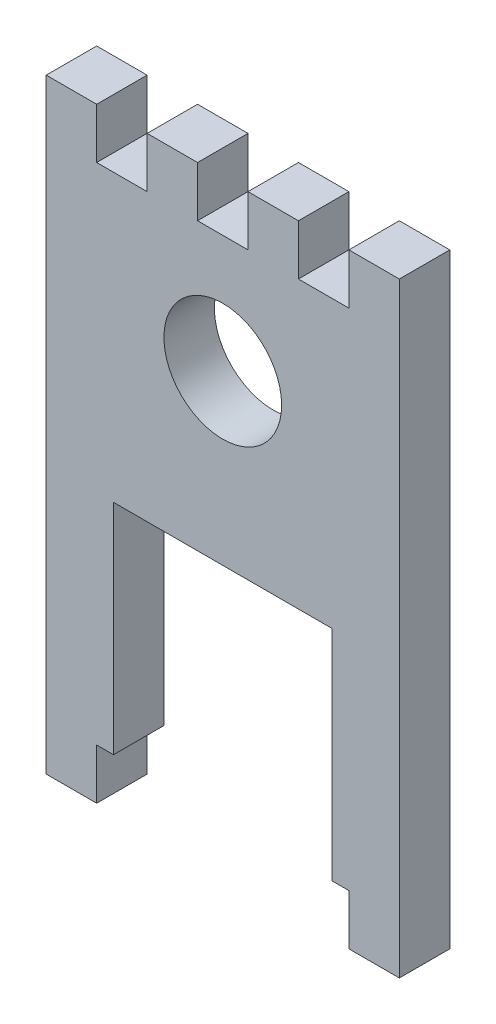
ISO-10303-21;
HEADER;
FILE_DESCRIPTION(('STEP AP214'),'2;1');
FILE_NAME('part.step','',(''),(''),'','','');
FILE_SCHEMA(('AUTOMOTIVE_DESIGN { 1 0 10303 214 1 1 1 1 }'));
ENDSEC;
DATA;
#1=APPLICATION_CONTEXT('core data for automotive mechanical design processes');
#2=APPLICATION_PROTOCOL_DEFINITION('international standard','automotive_design',2000,#1);
#3=PRODUCT_CONTEXT('',#1,'mechanical');
#4=PRODUCT('Part','Part','',(#3));
#5=PRODUCT_RELATED_PRODUCT_CATEGORY('part','',(#4));
#6=PRODUCT_DEFINITION_FORMATION('','',#4);
#7=PRODUCT_DEFINITION_CONTEXT('part definition',#1,'design');
#8=PRODUCT_DEFINITION('design','',#6,#7);
#9=PRODUCT_DEFINITION_SHAPE('','',#8);
#10=(LENGTH_UNIT() NAMED_UNIT(*) SI_UNIT(.MILLI.,.METRE.));
#11=(NAMED_UNIT(*) PLANE_ANGLE_UNIT() SI_UNIT($,.RADIAN.));
#12=(NAMED_UNIT(*) SI_UNIT($,.STERADIAN.) SOLID_ANGLE_UNIT());
#13=UNCERTAINTY_MEASURE_WITH_UNIT(LENGTH_MEASURE(1.E-05),#10,'distance_accuracy_value','');
#14=(GEOMETRIC_REPRESENTATION_CONTEXT(3) GLOBAL_UNCERTAINTY_ASSIGNED_CONTEXT((#13)) GLOBAL_UNIT_ASSIGNED_CONTEXT((#10,
#11,#12)) REPRESENTATION_CONTEXT('',''));
#15=CARTESIAN_POINT('',(0.,0.,0.));
#16=DIRECTION('',(0.,0.,1.));
#17=DIRECTION('',(1.,0.,0.));
#18=AXIS2_PLACEMENT_3D('',#15,#16,#17);
#19=CARTESIAN_POINT('',(0.,0.,3.));
#20=DIRECTION('',(0.,0.,1.));
#21=DIRECTION('',(1.,0.,0.));
#22=AXIS2_PLACEMENT_3D('',#19,#20,#21);
#23=PLANE('',#22);
#24=DIRECTION('',(0.,-1.,0.));
#25=VECTOR('',#24,1.);
#26=CARTESIAN_POINT('',(-9.96629949871549,13.71,3.));
#27=LINE('',#26,#25);
#28=CARTESIAN_POINT('',(-9.96629949871549,13.71,3.));
#29=VERTEX_POINT('',#28);
#30=CARTESIAN_POINT('',(-9.96629949871548,-22.29,3.));
#31=VERTEX_POINT('',#30);
#32=EDGE_CURVE('E276',#29,#31,#27,.T.);
#33=ORIENTED_EDGE('',*,*,#32,.T.);
#34=DIRECTION('',(1.,0.,0.));
#35=VECTOR('',#34,1.);
#36=CARTESIAN_POINT('',(-9.96629949871548,-22.29,3.));
#37=LINE('',#36,#35);
#38=CARTESIAN_POINT('',(-6.96629949871548,-22.29,3.));
#39=VERTEX_POINT('',#38);
#40=EDGE_CURVE('E144',#31,#39,#37,.T.);
#41=ORIENTED_EDGE('',*,*,#40,.T.);
#42=DIRECTION('',(0.,1.,0.));
#43=VECTOR('',#42,1.);
#44=CARTESIAN_POINT('',(-6.96629949871548,-19.29,3.));
#45=LINE('',#44,#43);
#46=CARTESIAN_POINT('',(-6.96629949871548,-19.29,3.));
#47=VERTEX_POINT('',#46);
#48=EDGE_CURVE('E339',#39,#47,#45,.T.);
#49=ORIENTED_EDGE('',*,*,#48,.T.);
#50=DIRECTION('',(1.,0.,0.));
#51=VECTOR('',#50,1.);
#52=CARTESIAN_POINT('',(-6.96629949871548,-19.29,3.));
#53=LINE('',#52,#51);
#54=CARTESIAN_POINT('',(-5.96629949871548,-19.29,3.));
#55=VERTEX_POINT('',#54);
#56=EDGE_CURVE('E358',#47,#55,#53,.T.);
#57=ORIENTED_EDGE('',*,*,#56,.T.);
#58=DIRECTION('',(0.,1.,0.));
#59=VECTOR('',#58,1.);
#60=CARTESIAN_POINT('',(-5.96629949871548,-6.29,3.));
#61=LINE('',#60,#59);
#62=CARTESIAN_POINT('',(-5.96629949871548,-6.29,3.));
#63=VERTEX_POINT('',#62);
#64=EDGE_CURVE('E355',#55,#63,#61,.T.);
#65=ORIENTED_EDGE('',*,*,#64,.T.);
#66=DIRECTION('',(1.,0.,0.));
#67=VECTOR('',#66,1.);
#68=CARTESIAN_POINT('',(-5.96629949871548,-6.29,3.));
#69=LINE('',#68,#67);
#70=CARTESIAN_POINT('',(7.03370050128452,-6.29,3.));
#71=VERTEX_POINT('',#70);
#72=EDGE_CURVE('E357',#63,#71,#69,.T.);
#73=ORIENTED_EDGE('',*,*,#72,.T.);
#74=DIRECTION('',(0.,-1.,0.));
#75=VECTOR('',#74,1.);
#76=CARTESIAN_POINT('',(7.03370050128452,-6.29,3.));
#77=LINE('',#76,#75);
#78=CARTESIAN_POINT('',(7.03370050128452,-19.29,3.));
#79=VERTEX_POINT('',#78);
#80=EDGE_CURVE('E360',#71,#79,#77,.T.);
#81=ORIENTED_EDGE('',*,*,#80,.T.);
#82=DIRECTION('',(1.,0.,0.));
#83=VECTOR('',#82,1.);
#84=CARTESIAN_POINT('',(8.03370050128452,-19.29,3.));
#85=LINE('',#84,#83);
#86=CARTESIAN_POINT('',(8.03370050128452,-19.29,3.));
#87=VERTEX_POINT('',#86);
#88=EDGE_CURVE('E366',#79,#87,#85,.T.);
#89=ORIENTED_EDGE('',*,*,#88,.T.);
#90=DIRECTION('',(0.,-1.,0.));
#91=VECTOR('',#90,1.);
#92=CARTESIAN_POINT('',(8.03370050128452,-19.29,3.));
#93=LINE('',#92,#91);
#94=CARTESIAN_POINT('',(8.03370050128452,-22.29,3.));
#95=VERTEX_POINT('',#94);
#96=EDGE_CURVE('E368',#87,#95,#93,.T.);
#97=ORIENTED_EDGE('',*,*,#96,.T.);
#98=DIRECTION('',(1.,0.,0.));
#99=VECTOR('',#98,1.);
#100=CARTESIAN_POINT('',(8.03370050128452,-22.29,3.));
#101=LINE('',#100,#99);
#102=CARTESIAN_POINT('',(11.0337005012845,-22.29,3.));
#103=VERTEX_POINT('',#102);
#104=EDGE_CURVE('E370',#95,#103,#101,.T.);
#105=ORIENTED_EDGE('',*,*,#104,.T.);
#106=DIRECTION('',(0.,1.,0.));
#107=VECTOR('',#106,1.);
#108=CARTESIAN_POINT('',(11.0337005012845,13.71,3.));
#109=LINE('',#108,#107);
#110=CARTESIAN_POINT('',(11.0337005012845,13.71,3.));
#111=VERTEX_POINT('',#110);
#112=EDGE_CURVE('E372',#103,#111,#109,.T.);
#113=ORIENTED_EDGE('',*,*,#112,.T.);
#114=DIRECTION('',(-1.,0.,0.));
#115=VECTOR('',#114,1.);
#116=CARTESIAN_POINT('',(8.03370050128452,13.71,3.));
#117=LINE('',#116,#115);
#118=CARTESIAN_POINT('',(8.03370050128452,13.71,3.));
#119=VERTEX_POINT('',#118);
#120=EDGE_CURVE('E374',#111,#119,#117,.T.);
#121=ORIENTED_EDGE('',*,*,#120,.T.);
#122=DIRECTION('',(0.,-1.,0.));
#123=VECTOR('',#122,1.);
#124=CARTESIAN_POINT('',(8.03370050128452,10.71,3.));
#125=LINE('',#124,#123);
#126=CARTESIAN_POINT('',(8.03370050128452,10.71,3.));
#127=VERTEX_POINT('',#126);
#128=EDGE_CURVE('E376',#119,#127,#125,.T.);
#129=ORIENTED_EDGE('',*,*,#128,.T.);
#130=DIRECTION('',(-1.,0.,0.));
#131=VECTOR('',#130,1.);
#132=CARTESIAN_POINT('',(8.03370050128452,10.71,3.));
#133=LINE('',#132,#131);
#134=CARTESIAN_POINT('',(5.03370050128452,10.71,3.));
#135=VERTEX_POINT('',#134);
#136=EDGE_CURVE('E378',#127,#135,#133,.T.);
#137=ORIENTED_EDGE('',*,*,#136,.T.);
#138=DIRECTION('',(0.,1.,0.));
#139=VECTOR('',#138,1.);
#140=CARTESIAN_POINT('',(5.03370050128452,10.71,3.));
#141=LINE('',#140,#139);
#142=CARTESIAN_POINT('',(5.03370050128452,13.71,3.));
#143=VERTEX_POINT('',#142);
#144=EDGE_CURVE('E380',#135,#143,#141,.T.);
#145=ORIENTED_EDGE('',*,*,#144,.T.);
#146=DIRECTION('',(-1.,0.,0.));
#147=VECTOR('',#146,1.);
#148=CARTESIAN_POINT('',(2.03370050128452,13.71,3.));
#149=LINE('',#148,#147);
#150=CARTESIAN_POINT('',(2.03370050128452,13.71,3.));
#151=VERTEX_POINT('',#150);
#152=EDGE_CURVE('E382',#143,#151,#149,.T.);
#153=ORIENTED_EDGE('',*,*,#152,.T.);
#154=DIRECTION('',(0.,-1.,0.));
#155=VECTOR('',#154,1.);
#156=CARTESIAN_POINT('',(2.03370050128452,10.71,3.));
#157=LINE('',#156,#155);
#158=CARTESIAN_POINT('',(2.03370050128452,10.71,3.));
#159=VERTEX_POINT('',#158);
#160=EDGE_CURVE('E384',#151,#159,#157,.T.);
#161=ORIENTED_EDGE('',*,*,#160,.T.);
#162=DIRECTION('',(-1.,0.,0.));
#163=VECTOR('',#162,1.);
#164=CARTESIAN_POINT('',(-0.966299498715482,10.71,3.));
#165=LINE('',#164,#163);
#166=CARTESIAN_POINT('',(-0.966299498715482,10.71,3.));
#167=VERTEX_POINT('',#166);
#168=EDGE_CURVE('E386',#159,#167,#165,.T.);
#169=ORIENTED_EDGE('',*,*,#168,.T.);
#170=DIRECTION('',(0.,1.,0.));
#171=VECTOR('',#170,1.);
#172=CARTESIAN_POINT('',(-0.966299498715482,10.71,3.));
#173=LINE('',#172,#171);
#174=CARTESIAN_POINT('',(-0.966299498715481,13.71,3.));
#175=VERTEX_POINT('',#174);
#176=EDGE_CURVE('E388',#167,#175,#173,.T.);
#177=ORIENTED_EDGE('',*,*,#176,.T.);
#178=DIRECTION('',(-1.,0.,0.));
#179=VECTOR('',#178,1.);
#180=CARTESIAN_POINT('',(-3.96629949871548,13.71,3.));
#181=LINE('',#180,#179);
#182=CARTESIAN_POINT('',(-3.96629949871548,13.71,3.));
#183=VERTEX_POINT('',#182);
#184=EDGE_CURVE('E390',#175,#183,#181,.T.);
#185=ORIENTED_EDGE('',*,*,#184,.T.);
#186=DIRECTION('',(0.,-1.,0.));
#187=VECTOR('',#186,1.);
#188=CARTESIAN_POINT('',(-3.96629949871548,10.71,3.));
#189=LINE('',#188,#187);
#190=CARTESIAN_POINT('',(-3.96629949871548,10.71,3.));
#191=VERTEX_POINT('',#190);
#192=EDGE_CURVE('E211',#183,#191,#189,.T.);
#193=ORIENTED_EDGE('',*,*,#192,.T.);
#194=DIRECTION('',(-1.,0.,0.));
#195=VECTOR('',#194,1.);
#196=CARTESIAN_POINT('',(-6.96629949871548,10.71,3.));
#197=LINE('',#196,#195);
#198=CARTESIAN_POINT('',(-6.96629949871548,10.71,3.));
#199=VERTEX_POINT('',#198);
#200=EDGE_CURVE('E205',#191,#199,#197,.T.);
#201=ORIENTED_EDGE('',*,*,#200,.T.);
#202=DIRECTION('',(0.,1.,0.));
#203=VECTOR('',#202,1.);
#204=CARTESIAN_POINT('',(-6.96629949871548,10.71,3.));
#205=LINE('',#204,#203);
#206=CARTESIAN_POINT('',(-6.96629949871548,13.71,3.));
#207=VERTEX_POINT('',#206);
#208=EDGE_CURVE('E209',#199,#207,#205,.T.);
#209=ORIENTED_EDGE('',*,*,#208,.T.);
#210=DIRECTION('',(-1.,0.,0.));
#211=VECTOR('',#210,1.);
#212=CARTESIAN_POINT('',(-9.96629949871549,13.71,3.));
#213=LINE('',#212,#211);
#214=EDGE_CURVE('E53',#207,#29,#213,.T.);
#215=ORIENTED_EDGE('',*,*,#214,.T.);
#216=EDGE_LOOP('',(#33,#41,#49,#57,#65,#73,#81,#89,#97,#105,#113,#121,#129,#137,#145,#153,#161,
#169,#177,#185,#193,#201,#209,#215));
#217=FACE_BOUND('',#216,.T.);
#218=CARTESIAN_POINT('',(0.533700501284521,3.71,3.));
#219=DIRECTION('',(0.,0.,1.));
#220=DIRECTION('',(1.,0.,0.));
#221=AXIS2_PLACEMENT_3D('',#218,#219,#220);
#222=CIRCLE('',#221,3.5);
#223=CARTESIAN_POINT('',(4.03370050128452,3.71,3.));
#224=VERTEX_POINT('',#223);
#225=EDGE_CURVE('E233',#224,#224,#222,.T.);
#226=ORIENTED_EDGE('',*,*,#225,.F.);
#227=EDGE_LOOP('',(#226));
#228=FACE_BOUND('',#227,.T.);
#229=ADVANCED_FACE('F36',(#217,#228),#23,.T.);
#230=CARTESIAN_POINT('',(0.,0.,0.));
#231=DIRECTION('',(0.,0.,1.));
#232=DIRECTION('',(1.,0.,0.));
#233=AXIS2_PLACEMENT_3D('',#230,#231,#232);
#234=PLANE('',#233);
#235=DIRECTION('',(0.,-1.,0.));
#236=VECTOR('',#235,1.);
#237=CARTESIAN_POINT('',(-9.96629949871549,13.71,0.));
#238=LINE('',#237,#236);
#239=CARTESIAN_POINT('',(-9.96629949871549,13.71,0.));
#240=VERTEX_POINT('',#239);
#241=CARTESIAN_POINT('',(-9.96629949871548,-22.29,0.));
#242=VERTEX_POINT('',#241);
#243=EDGE_CURVE('E229',#240,#242,#238,.T.);
#244=ORIENTED_EDGE('',*,*,#243,.F.);
#245=DIRECTION('',(-1.,0.,0.));
#246=VECTOR('',#245,1.);
#247=CARTESIAN_POINT('',(-9.96629949871549,13.71,0.));
#248=LINE('',#247,#246);
#249=CARTESIAN_POINT('',(-6.96629949871548,13.71,0.));
#250=VERTEX_POINT('',#249);
#251=EDGE_CURVE('E136',#250,#240,#248,.T.);
#252=ORIENTED_EDGE('',*,*,#251,.F.);
#253=DIRECTION('',(0.,1.,0.));
#254=VECTOR('',#253,1.);
#255=CARTESIAN_POINT('',(-6.96629949871548,10.71,0.));
#256=LINE('',#255,#254);
#257=CARTESIAN_POINT('',(-6.96629949871548,10.71,0.));
#258=VERTEX_POINT('',#257);
#259=EDGE_CURVE('E130',#258,#250,#256,.T.);
#260=ORIENTED_EDGE('',*,*,#259,.F.);
#261=DIRECTION('',(-1.,0.,0.));
#262=VECTOR('',#261,1.);
#263=CARTESIAN_POINT('',(-6.96629949871548,10.71,0.));
#264=LINE('',#263,#262);
#265=CARTESIAN_POINT('',(-3.96629949871548,10.71,0.));
#266=VERTEX_POINT('',#265);
#267=EDGE_CURVE('E219',#266,#258,#264,.T.);
#268=ORIENTED_EDGE('',*,*,#267,.F.);
#269=DIRECTION('',(0.,-1.,0.));
#270=VECTOR('',#269,1.);
#271=CARTESIAN_POINT('',(-3.96629949871548,10.71,0.));
#272=LINE('',#271,#270);
#273=CARTESIAN_POINT('',(-3.96629949871548,13.71,0.));
#274=VERTEX_POINT('',#273);
#275=EDGE_CURVE('E271',#274,#266,#272,.T.);
#276=ORIENTED_EDGE('',*,*,#275,.F.);
#277=DIRECTION('',(-1.,0.,0.));
#278=VECTOR('',#277,1.);
#279=CARTESIAN_POINT('',(-3.96629949871548,13.71,0.));
#280=LINE('',#279,#278);
#281=CARTESIAN_POINT('',(-0.966299498715481,13.71,0.));
#282=VERTEX_POINT('',#281);
#283=EDGE_CURVE('E269',#282,#274,#280,.T.);
#284=ORIENTED_EDGE('',*,*,#283,.F.);
#285=DIRECTION('',(0.,1.,0.));
#286=VECTOR('',#285,1.);
#287=CARTESIAN_POINT('',(-0.966299498715482,10.71,0.));
#288=LINE('',#287,#286);
#289=CARTESIAN_POINT('',(-0.966299498715482,10.71,0.));
#290=VERTEX_POINT('',#289);
#291=EDGE_CURVE('E267',#290,#282,#288,.T.);
#292=ORIENTED_EDGE('',*,*,#291,.F.);
#293=DIRECTION('',(-1.,0.,0.));
#294=VECTOR('',#293,1.);
#295=CARTESIAN_POINT('',(-0.966299498715482,10.71,0.));
#296=LINE('',#295,#294);
#297=CARTESIAN_POINT('',(2.03370050128452,10.71,0.));
#298=VERTEX_POINT('',#297);
#299=EDGE_CURVE('E265',#298,#290,#296,.T.);
#300=ORIENTED_EDGE('',*,*,#299,.F.);
#301=DIRECTION('',(0.,-1.,0.));
#302=VECTOR('',#301,1.);
#303=CARTESIAN_POINT('',(2.03370050128452,10.71,0.));
#304=LINE('',#303,#302);
#305=CARTESIAN_POINT('',(2.03370050128452,13.71,0.));
#306=VERTEX_POINT('',#305);
#307=EDGE_CURVE('E263',#306,#298,#304,.T.);
#308=ORIENTED_EDGE('',*,*,#307,.F.);
#309=DIRECTION('',(-1.,0.,0.));
#310=VECTOR('',#309,1.);
#311=CARTESIAN_POINT('',(2.03370050128452,13.71,0.));
#312=LINE('',#311,#310);
#313=CARTESIAN_POINT('',(5.03370050128452,13.71,0.));
#314=VERTEX_POINT('',#313);
#315=EDGE_CURVE('E261',#314,#306,#312,.T.);
#316=ORIENTED_EDGE('',*,*,#315,.F.);
#317=DIRECTION('',(0.,1.,0.));
#318=VECTOR('',#317,1.);
#319=CARTESIAN_POINT('',(5.03370050128452,10.71,0.));
#320=LINE('',#319,#318);
#321=CARTESIAN_POINT('',(5.03370050128452,10.71,0.));
#322=VERTEX_POINT('',#321);
#323=EDGE_CURVE('E259',#322,#314,#320,.T.);
#324=ORIENTED_EDGE('',*,*,#323,.F.);
#325=DIRECTION('',(-1.,0.,0.));
#326=VECTOR('',#325,1.);
#327=CARTESIAN_POINT('',(8.03370050128452,10.71,0.));
#328=LINE('',#327,#326);
#329=CARTESIAN_POINT('',(8.03370050128452,10.71,0.));
#330=VERTEX_POINT('',#329);
#331=EDGE_CURVE('E257',#330,#322,#328,.T.);
#332=ORIENTED_EDGE('',*,*,#331,.F.);
#333=DIRECTION('',(0.,-1.,0.));
#334=VECTOR('',#333,1.);
#335=CARTESIAN_POINT('',(8.03370050128452,10.71,0.));
#336=LINE('',#335,#334);
#337=CARTESIAN_POINT('',(8.03370050128452,13.71,0.));
#338=VERTEX_POINT('',#337);
#339=EDGE_CURVE('E255',#338,#330,#336,.T.);
#340=ORIENTED_EDGE('',*,*,#339,.F.);
#341=DIRECTION('',(-1.,0.,0.));
#342=VECTOR('',#341,1.);
#343=CARTESIAN_POINT('',(8.03370050128452,13.71,0.));
#344=LINE('',#343,#342);
#345=CARTESIAN_POINT('',(11.0337005012845,13.71,0.));
#346=VERTEX_POINT('',#345);
#347=EDGE_CURVE('E253',#346,#338,#344,.T.);
#348=ORIENTED_EDGE('',*,*,#347,.F.);
#349=DIRECTION('',(0.,1.,0.));
#350=VECTOR('',#349,1.);
#351=CARTESIAN_POINT('',(11.0337005012845,13.71,0.));
#352=LINE('',#351,#350);
#353=CARTESIAN_POINT('',(11.0337005012845,-22.29,0.));
#354=VERTEX_POINT('',#353);
#355=EDGE_CURVE('E251',#354,#346,#352,.T.);
#356=ORIENTED_EDGE('',*,*,#355,.F.);
#357=DIRECTION('',(1.,0.,0.));
#358=VECTOR('',#357,1.);
#359=CARTESIAN_POINT('',(8.03370050128452,-22.29,0.));
#360=LINE('',#359,#358);
#361=CARTESIAN_POINT('',(8.03370050128452,-22.29,0.));
#362=VERTEX_POINT('',#361);
#363=EDGE_CURVE('E249',#362,#354,#360,.T.);
#364=ORIENTED_EDGE('',*,*,#363,.F.);
#365=DIRECTION('',(0.,-1.,0.));
#366=VECTOR('',#365,1.);
#367=CARTESIAN_POINT('',(8.03370050128452,-19.29,0.));
#368=LINE('',#367,#366);
#369=CARTESIAN_POINT('',(8.03370050128452,-19.29,0.));
#370=VERTEX_POINT('',#369);
#371=EDGE_CURVE('E247',#370,#362,#368,.T.);
#372=ORIENTED_EDGE('',*,*,#371,.F.);
#373=DIRECTION('',(1.,0.,0.));
#374=VECTOR('',#373,1.);
#375=CARTESIAN_POINT('',(8.03370050128452,-19.29,0.));
#376=LINE('',#375,#374);
#377=CARTESIAN_POINT('',(7.03370050128452,-19.29,0.));
#378=VERTEX_POINT('',#377);
#379=EDGE_CURVE('E245',#378,#370,#376,.T.);
#380=ORIENTED_EDGE('',*,*,#379,.F.);
#381=DIRECTION('',(0.,-1.,0.));
#382=VECTOR('',#381,1.);
#383=CARTESIAN_POINT('',(7.03370050128452,-6.29,0.));
#384=LINE('',#383,#382);
#385=CARTESIAN_POINT('',(7.03370050128452,-6.29,0.));
#386=VERTEX_POINT('',#385);
#387=EDGE_CURVE('E243',#386,#378,#384,.T.);
#388=ORIENTED_EDGE('',*,*,#387,.F.);
#389=DIRECTION('',(1.,0.,0.));
#390=VECTOR('',#389,1.);
#391=CARTESIAN_POINT('',(-5.96629949871548,-6.29,0.));
#392=LINE('',#391,#390);
#393=CARTESIAN_POINT('',(-5.96629949871548,-6.29,0.));
#394=VERTEX_POINT('',#393);
#395=EDGE_CURVE('E241',#394,#386,#392,.T.);
#396=ORIENTED_EDGE('',*,*,#395,.F.);
#397=DIRECTION('',(0.,1.,0.));
#398=VECTOR('',#397,1.);
#399=CARTESIAN_POINT('',(-5.96629949871548,-6.29,0.));
#400=LINE('',#399,#398);
#401=CARTESIAN_POINT('',(-5.96629949871548,-19.29,0.));
#402=VERTEX_POINT('',#401);
#403=EDGE_CURVE('E239',#402,#394,#400,.T.);
#404=ORIENTED_EDGE('',*,*,#403,.F.);
#405=DIRECTION('',(1.,0.,0.));
#406=VECTOR('',#405,1.);
#407=CARTESIAN_POINT('',(-6.96629949871548,-19.29,0.));
#408=LINE('',#407,#406);
#409=CARTESIAN_POINT('',(-6.96629949871548,-19.29,0.));
#410=VERTEX_POINT('',#409);
#411=EDGE_CURVE('E237',#410,#402,#408,.T.);
#412=ORIENTED_EDGE('',*,*,#411,.F.);
#413=DIRECTION('',(0.,1.,0.));
#414=VECTOR('',#413,1.);
#415=CARTESIAN_POINT('',(-6.96629949871548,-19.29,0.));
#416=LINE('',#415,#414);
#417=CARTESIAN_POINT('',(-6.96629949871548,-22.29,0.));
#418=VERTEX_POINT('',#417);
#419=EDGE_CURVE('E235',#418,#410,#416,.T.);
#420=ORIENTED_EDGE('',*,*,#419,.F.);
#421=DIRECTION('',(1.,0.,0.));
#422=VECTOR('',#421,1.);
#423=CARTESIAN_POINT('',(-9.96629949871548,-22.29,0.));
#424=LINE('',#423,#422);
#425=EDGE_CURVE('E232',#242,#418,#424,.T.);
#426=ORIENTED_EDGE('',*,*,#425,.F.);
#427=EDGE_LOOP('',(#244,#252,#260,#268,#276,#284,#292,#300,#308,#316,#324,#332,#340,#348,#356,
#364,#372,#380,#388,#396,#404,#412,#420,#426));
#428=FACE_BOUND('',#427,.T.);
#429=CARTESIAN_POINT('',(0.533700501284521,3.71,0.));
#430=DIRECTION('',(0.,0.,1.));
#431=DIRECTION('',(1.,0.,0.));
#432=AXIS2_PLACEMENT_3D('',#429,#430,#431);
#433=CIRCLE('',#432,3.5);
#434=CARTESIAN_POINT('',(4.03370050128452,3.71,0.));
#435=VERTEX_POINT('',#434);
#436=EDGE_CURVE('E693',#435,#435,#433,.T.);
#437=ORIENTED_EDGE('',*,*,#436,.T.);
#438=EDGE_LOOP('',(#437));
#439=FACE_BOUND('',#438,.T.);
#440=ADVANCED_FACE('F343',(#428,#439),#234,.F.);
#441=CARTESIAN_POINT('',(-9.96629949871549,13.71,3.));
#442=DIRECTION('',(1.,0.,0.));
#443=DIRECTION('',(0.,1.,0.));
#444=AXIS2_PLACEMENT_3D('',#441,#442,#443);
#445=PLANE('',#444);
#446=ORIENTED_EDGE('',*,*,#243,.T.);
#447=DIRECTION('',(0.,0.,-1.));
#448=VECTOR('',#447,1.);
#449=CARTESIAN_POINT('',(-9.96629949871548,-22.29,3.));
#450=LINE('',#449,#448);
#451=EDGE_CURVE('E11',#31,#242,#450,.T.);
#452=ORIENTED_EDGE('',*,*,#451,.F.);
#453=ORIENTED_EDGE('',*,*,#32,.F.);
#454=DIRECTION('',(0.,0.,-1.));
#455=VECTOR('',#454,1.);
#456=CARTESIAN_POINT('',(-9.96629949871549,13.71,3.));
#457=LINE('',#456,#455);
#458=EDGE_CURVE('E225',#29,#240,#457,.T.);
#459=ORIENTED_EDGE('',*,*,#458,.T.);
#460=EDGE_LOOP('',(#446,#452,#453,#459));
#461=FACE_BOUND('',#460,.T.);
#462=ADVANCED_FACE('F38',(#461),#445,.F.);
#463=CARTESIAN_POINT('',(-9.96629949871548,-22.29,3.));
#464=DIRECTION('',(0.,1.,0.));
#465=DIRECTION('',(0.,0.,1.));
#466=AXIS2_PLACEMENT_3D('',#463,#464,#465);
#467=PLANE('',#466);
#468=ORIENTED_EDGE('',*,*,#425,.T.);
#469=DIRECTION('',(0.,0.,-1.));
#470=VECTOR('',#469,1.);
#471=CARTESIAN_POINT('',(-6.96629949871548,-22.29,3.));
#472=LINE('',#471,#470);
#473=EDGE_CURVE('E45',#39,#418,#472,.T.);
#474=ORIENTED_EDGE('',*,*,#473,.F.);
#475=ORIENTED_EDGE('',*,*,#40,.F.);
#476=ORIENTED_EDGE('',*,*,#451,.T.);
#477=EDGE_LOOP('',(#468,#474,#475,#476));
#478=FACE_BOUND('',#477,.T.);
#479=ADVANCED_FACE('F424',(#478),#467,.F.);
#480=CARTESIAN_POINT('',(-6.96629949871548,-19.29,3.));
#481=DIRECTION('',(-1.,0.,0.));
#482=DIRECTION('',(0.,0.,1.));
#483=AXIS2_PLACEMENT_3D('',#480,#481,#482);
#484=PLANE('',#483);
#485=ORIENTED_EDGE('',*,*,#419,.T.);
#486=DIRECTION('',(0.,0.,-1.));
#487=VECTOR('',#486,1.);
#488=CARTESIAN_POINT('',(-6.96629949871548,-19.29,3.));
#489=LINE('',#488,#487);
#490=EDGE_CURVE('E331',#47,#410,#489,.T.);
#491=ORIENTED_EDGE('',*,*,#490,.F.);
#492=ORIENTED_EDGE('',*,*,#48,.F.);
#493=ORIENTED_EDGE('',*,*,#473,.T.);
#494=EDGE_LOOP('',(#485,#491,#492,#493));
#495=FACE_BOUND('',#494,.T.);
#496=ADVANCED_FACE('F337',(#495),#484,.F.);
#497=CARTESIAN_POINT('',(-6.96629949871548,-19.29,3.));
#498=DIRECTION('',(0.,1.,0.));
#499=DIRECTION('',(0.,0.,1.));
#500=AXIS2_PLACEMENT_3D('',#497,#498,#499);
#501=PLANE('',#500);
#502=ORIENTED_EDGE('',*,*,#411,.T.);
#503=DIRECTION('',(0.,0.,-1.));
#504=VECTOR('',#503,1.);
#505=CARTESIAN_POINT('',(-5.96629949871548,-19.29,3.));
#506=LINE('',#505,#504);
#507=EDGE_CURVE('E328',#55,#402,#506,.T.);
#508=ORIENTED_EDGE('',*,*,#507,.F.);
#509=ORIENTED_EDGE('',*,*,#56,.F.);
#510=ORIENTED_EDGE('',*,*,#490,.T.);
#511=EDGE_LOOP('',(#502,#508,#509,#510));
#512=FACE_BOUND('',#511,.T.);
#513=ADVANCED_FACE('F349',(#512),#501,.F.);
#514=CARTESIAN_POINT('',(-5.96629949871548,-6.29,3.));
#515=DIRECTION('',(-1.,0.,0.));
#516=DIRECTION('',(0.,-1.,0.));
#517=AXIS2_PLACEMENT_3D('',#514,#515,#516);
#518=PLANE('',#517);
#519=ORIENTED_EDGE('',*,*,#403,.T.);
#520=DIRECTION('',(0.,0.,-1.));
#521=VECTOR('',#520,1.);
#522=CARTESIAN_POINT('',(-5.96629949871548,-6.29,3.));
#523=LINE('',#522,#521);
#524=EDGE_CURVE('E325',#63,#394,#523,.T.);
#525=ORIENTED_EDGE('',*,*,#524,.F.);
#526=ORIENTED_EDGE('',*,*,#64,.F.);
#527=ORIENTED_EDGE('',*,*,#507,.T.);
#528=EDGE_LOOP('',(#519,#525,#526,#527));
#529=FACE_BOUND('',#528,.T.);
#530=ADVANCED_FACE('F353',(#529),#518,.F.);
#531=CARTESIAN_POINT('',(-5.96629949871548,-6.29,3.));
#532=DIRECTION('',(0.,1.,0.));
#533=DIRECTION('',(0.,0.,1.));
#534=AXIS2_PLACEMENT_3D('',#531,#532,#533);
#535=PLANE('',#534);
#536=ORIENTED_EDGE('',*,*,#395,.T.);
#537=DIRECTION('',(0.,0.,-1.));
#538=VECTOR('',#537,1.);
#539=CARTESIAN_POINT('',(7.03370050128452,-6.29,3.));
#540=LINE('',#539,#538);
#541=EDGE_CURVE('E322',#71,#386,#540,.T.);
#542=ORIENTED_EDGE('',*,*,#541,.F.);
#543=ORIENTED_EDGE('',*,*,#72,.F.);
#544=ORIENTED_EDGE('',*,*,#524,.T.);
#545=EDGE_LOOP('',(#536,#542,#543,#544));
#546=FACE_BOUND('',#545,.T.);
#547=ADVANCED_FACE('F437',(#546),#535,.F.);
#548=CARTESIAN_POINT('',(7.03370050128452,-6.29,3.));
#549=DIRECTION('',(1.,0.,0.));
#550=DIRECTION('',(0.,1.,0.));
#551=AXIS2_PLACEMENT_3D('',#548,#549,#550);
#552=PLANE('',#551);
#553=ORIENTED_EDGE('',*,*,#387,.T.);
#554=DIRECTION('',(0.,0.,-1.));
#555=VECTOR('',#554,1.);
#556=CARTESIAN_POINT('',(7.03370050128452,-19.29,3.));
#557=LINE('',#556,#555);
#558=EDGE_CURVE('E319',#79,#378,#557,.T.);
#559=ORIENTED_EDGE('',*,*,#558,.F.);
#560=ORIENTED_EDGE('',*,*,#80,.F.);
#561=ORIENTED_EDGE('',*,*,#541,.T.);
#562=EDGE_LOOP('',(#553,#559,#560,#561));
#563=FACE_BOUND('',#562,.T.);
#564=ADVANCED_FACE('F440',(#563),#552,.F.);
#565=CARTESIAN_POINT('',(8.03370050128452,-19.29,3.));
#566=DIRECTION('',(0.,1.,0.));
#567=DIRECTION('',(0.,0.,1.));
#568=AXIS2_PLACEMENT_3D('',#565,#566,#567);
#569=PLANE('',#568);
#570=ORIENTED_EDGE('',*,*,#379,.T.);
#571=DIRECTION('',(0.,0.,-1.));
#572=VECTOR('',#571,1.);
#573=CARTESIAN_POINT('',(8.03370050128452,-19.29,3.));
#574=LINE('',#573,#572);
#575=EDGE_CURVE('E316',#87,#370,#574,.T.);
#576=ORIENTED_EDGE('',*,*,#575,.F.);
#577=ORIENTED_EDGE('',*,*,#88,.F.);
#578=ORIENTED_EDGE('',*,*,#558,.T.);
#579=EDGE_LOOP('',(#570,#576,#577,#578));
#580=FACE_BOUND('',#579,.T.);
#581=ADVANCED_FACE('F444',(#580),#569,.F.);
#582=CARTESIAN_POINT('',(8.03370050128452,-19.29,3.));
#583=DIRECTION('',(1.,0.,0.));
#584=DIRECTION('',(0.,0.,-1.));
#585=AXIS2_PLACEMENT_3D('',#582,#583,#584);
#586=PLANE('',#585);
#587=ORIENTED_EDGE('',*,*,#371,.T.);
#588=DIRECTION('',(0.,0.,-1.));
#589=VECTOR('',#588,1.);
#590=CARTESIAN_POINT('',(8.03370050128452,-22.29,3.));
#591=LINE('',#590,#589);
#592=EDGE_CURVE('E313',#95,#362,#591,.T.);
#593=ORIENTED_EDGE('',*,*,#592,.F.);
#594=ORIENTED_EDGE('',*,*,#96,.F.);
#595=ORIENTED_EDGE('',*,*,#575,.T.);
#596=EDGE_LOOP('',(#587,#593,#594,#595));
#597=FACE_BOUND('',#596,.T.);
#598=ADVANCED_FACE('F448',(#597),#586,.F.);
#599=CARTESIAN_POINT('',(8.03370050128452,-22.29,3.));
#600=DIRECTION('',(0.,1.,0.));
#601=DIRECTION('',(0.,0.,1.));
#602=AXIS2_PLACEMENT_3D('',#599,#600,#601);
#603=PLANE('',#602);
#604=ORIENTED_EDGE('',*,*,#363,.T.);
#605=DIRECTION('',(0.,0.,-1.));
#606=VECTOR('',#605,1.);
#607=CARTESIAN_POINT('',(11.0337005012845,-22.29,3.));
#608=LINE('',#607,#606);
#609=EDGE_CURVE('E310',#103,#354,#608,.T.);
#610=ORIENTED_EDGE('',*,*,#609,.F.);
#611=ORIENTED_EDGE('',*,*,#104,.F.);
#612=ORIENTED_EDGE('',*,*,#592,.T.);
#613=EDGE_LOOP('',(#604,#610,#611,#612));
#614=FACE_BOUND('',#613,.T.);
#615=ADVANCED_FACE('F452',(#614),#603,.F.);
#616=CARTESIAN_POINT('',(11.0337005012845,13.71,3.));
#617=DIRECTION('',(-1.,0.,0.));
#618=DIRECTION('',(0.,-1.,0.));
#619=AXIS2_PLACEMENT_3D('',#616,#617,#618);
#620=PLANE('',#619);
#621=ORIENTED_EDGE('',*,*,#355,.T.);
#622=DIRECTION('',(0.,0.,-1.));
#623=VECTOR('',#622,1.);
#624=CARTESIAN_POINT('',(11.0337005012845,13.71,3.));
#625=LINE('',#624,#623);
#626=EDGE_CURVE('E307',#111,#346,#625,.T.);
#627=ORIENTED_EDGE('',*,*,#626,.F.);
#628=ORIENTED_EDGE('',*,*,#112,.F.);
#629=ORIENTED_EDGE('',*,*,#609,.T.);
#630=EDGE_LOOP('',(#621,#627,#628,#629));
#631=FACE_BOUND('',#630,.T.);
#632=ADVANCED_FACE('F456',(#631),#620,.F.);
#633=CARTESIAN_POINT('',(8.03370050128452,13.71,3.));
#634=DIRECTION('',(0.,-1.,0.));
#635=DIRECTION('',(0.,0.,-1.));
#636=AXIS2_PLACEMENT_3D('',#633,#634,#635);
#637=PLANE('',#636);
#638=ORIENTED_EDGE('',*,*,#347,.T.);
#639=DIRECTION('',(0.,0.,-1.));
#640=VECTOR('',#639,1.);
#641=CARTESIAN_POINT('',(8.03370050128452,13.71,3.));
#642=LINE('',#641,#640);
#643=EDGE_CURVE('E304',#119,#338,#642,.T.);
#644=ORIENTED_EDGE('',*,*,#643,.F.);
#645=ORIENTED_EDGE('',*,*,#120,.F.);
#646=ORIENTED_EDGE('',*,*,#626,.T.);
#647=EDGE_LOOP('',(#638,#644,#645,#646));
#648=FACE_BOUND('',#647,.T.);
#649=ADVANCED_FACE('F460',(#648),#637,.F.);
#650=CARTESIAN_POINT('',(8.03370050128452,10.71,3.));
#651=DIRECTION('',(1.,0.,0.));
#652=DIRECTION('',(0.,0.,-1.));
#653=AXIS2_PLACEMENT_3D('',#650,#651,#652);
#654=PLANE('',#653);
#655=ORIENTED_EDGE('',*,*,#339,.T.);
#656=DIRECTION('',(0.,0.,-1.));
#657=VECTOR('',#656,1.);
#658=CARTESIAN_POINT('',(8.03370050128452,10.71,3.));
#659=LINE('',#658,#657);
#660=EDGE_CURVE('E301',#127,#330,#659,.T.);
#661=ORIENTED_EDGE('',*,*,#660,.F.);
#662=ORIENTED_EDGE('',*,*,#128,.F.);
#663=ORIENTED_EDGE('',*,*,#643,.T.);
#664=EDGE_LOOP('',(#655,#661,#662,#663));
#665=FACE_BOUND('',#664,.T.);
#666=ADVANCED_FACE('F464',(#665),#654,.F.);
#667=CARTESIAN_POINT('',(8.03370050128452,10.71,3.));
#668=DIRECTION('',(0.,-1.,0.));
#669=DIRECTION('',(0.,0.,-1.));
#670=AXIS2_PLACEMENT_3D('',#667,#668,#669);
#671=PLANE('',#670);
#672=ORIENTED_EDGE('',*,*,#331,.T.);
#673=DIRECTION('',(0.,0.,-1.));
#674=VECTOR('',#673,1.);
#675=CARTESIAN_POINT('',(5.03370050128452,10.71,3.));
#676=LINE('',#675,#674);
#677=EDGE_CURVE('E298',#135,#322,#676,.T.);
#678=ORIENTED_EDGE('',*,*,#677,.F.);
#679=ORIENTED_EDGE('',*,*,#136,.F.);
#680=ORIENTED_EDGE('',*,*,#660,.T.);
#681=EDGE_LOOP('',(#672,#678,#679,#680));
#682=FACE_BOUND('',#681,.T.);
#683=ADVANCED_FACE('F468',(#682),#671,.F.);
#684=CARTESIAN_POINT('',(5.03370050128452,10.71,3.));
#685=DIRECTION('',(-1.,0.,0.));
#686=DIRECTION('',(0.,-1.,0.));
#687=AXIS2_PLACEMENT_3D('',#684,#685,#686);
#688=PLANE('',#687);
#689=ORIENTED_EDGE('',*,*,#323,.T.);
#690=DIRECTION('',(0.,0.,-1.));
#691=VECTOR('',#690,1.);
#692=CARTESIAN_POINT('',(5.03370050128452,13.71,3.));
#693=LINE('',#692,#691);
#694=EDGE_CURVE('E295',#143,#314,#693,.T.);
#695=ORIENTED_EDGE('',*,*,#694,.F.);
#696=ORIENTED_EDGE('',*,*,#144,.F.);
#697=ORIENTED_EDGE('',*,*,#677,.T.);
#698=EDGE_LOOP('',(#689,#695,#696,#697));
#699=FACE_BOUND('',#698,.T.);
#700=ADVANCED_FACE('F472',(#699),#688,.F.);
#701=CARTESIAN_POINT('',(2.03370050128452,13.71,3.));
#702=DIRECTION('',(0.,-1.,0.));
#703=DIRECTION('',(0.,0.,-1.));
#704=AXIS2_PLACEMENT_3D('',#701,#702,#703);
#705=PLANE('',#704);
#706=ORIENTED_EDGE('',*,*,#315,.T.);
#707=DIRECTION('',(0.,0.,-1.));
#708=VECTOR('',#707,1.);
#709=CARTESIAN_POINT('',(2.03370050128452,13.71,3.));
#710=LINE('',#709,#708);
#711=EDGE_CURVE('E292',#151,#306,#710,.T.);
#712=ORIENTED_EDGE('',*,*,#711,.F.);
#713=ORIENTED_EDGE('',*,*,#152,.F.);
#714=ORIENTED_EDGE('',*,*,#694,.T.);
#715=EDGE_LOOP('',(#706,#712,#713,#714));
#716=FACE_BOUND('',#715,.T.);
#717=ADVANCED_FACE('F476',(#716),#705,.F.);
#718=CARTESIAN_POINT('',(2.03370050128452,10.71,3.));
#719=DIRECTION('',(1.,0.,0.));
#720=DIRECTION('',(0.,0.,-1.));
#721=AXIS2_PLACEMENT_3D('',#718,#719,#720);
#722=PLANE('',#721);
#723=ORIENTED_EDGE('',*,*,#307,.T.);
#724=DIRECTION('',(0.,0.,-1.));
#725=VECTOR('',#724,1.);
#726=CARTESIAN_POINT('',(2.03370050128452,10.71,3.));
#727=LINE('',#726,#725);
#728=EDGE_CURVE('E289',#159,#298,#727,.T.);
#729=ORIENTED_EDGE('',*,*,#728,.F.);
#730=ORIENTED_EDGE('',*,*,#160,.F.);
#731=ORIENTED_EDGE('',*,*,#711,.T.);
#732=EDGE_LOOP('',(#723,#729,#730,#731));
#733=FACE_BOUND('',#732,.T.);
#734=ADVANCED_FACE('F480',(#733),#722,.F.);
#735=CARTESIAN_POINT('',(-0.966299498715482,10.71,3.));
#736=DIRECTION('',(0.,-1.,0.));
#737=DIRECTION('',(0.,0.,-1.));
#738=AXIS2_PLACEMENT_3D('',#735,#736,#737);
#739=PLANE('',#738);
#740=ORIENTED_EDGE('',*,*,#299,.T.);
#741=DIRECTION('',(0.,0.,-1.));
#742=VECTOR('',#741,1.);
#743=CARTESIAN_POINT('',(-0.966299498715482,10.71,3.));
#744=LINE('',#743,#742);
#745=EDGE_CURVE('E286',#167,#290,#744,.T.);
#746=ORIENTED_EDGE('',*,*,#745,.F.);
#747=ORIENTED_EDGE('',*,*,#168,.F.);
#748=ORIENTED_EDGE('',*,*,#728,.T.);
#749=EDGE_LOOP('',(#740,#746,#747,#748));
#750=FACE_BOUND('',#749,.T.);
#751=ADVANCED_FACE('F484',(#750),#739,.F.);
#752=CARTESIAN_POINT('',(-0.966299498715482,10.71,3.));
#753=DIRECTION('',(-1.,0.,0.));
#754=DIRECTION('',(0.,-1.,0.));
#755=AXIS2_PLACEMENT_3D('',#752,#753,#754);
#756=PLANE('',#755);
#757=ORIENTED_EDGE('',*,*,#291,.T.);
#758=DIRECTION('',(0.,0.,-1.));
#759=VECTOR('',#758,1.);
#760=CARTESIAN_POINT('',(-0.966299498715481,13.71,3.));
#761=LINE('',#760,#759);
#762=EDGE_CURVE('E283',#175,#282,#761,.T.);
#763=ORIENTED_EDGE('',*,*,#762,.F.);
#764=ORIENTED_EDGE('',*,*,#176,.F.);
#765=ORIENTED_EDGE('',*,*,#745,.T.);
#766=EDGE_LOOP('',(#757,#763,#764,#765));
#767=FACE_BOUND('',#766,.T.);
#768=ADVANCED_FACE('F488',(#767),#756,.F.);
#769=CARTESIAN_POINT('',(-3.96629949871548,13.71,3.));
#770=DIRECTION('',(0.,-1.,0.));
#771=DIRECTION('',(0.,0.,-1.));
#772=AXIS2_PLACEMENT_3D('',#769,#770,#771);
#773=PLANE('',#772);
#774=ORIENTED_EDGE('',*,*,#283,.T.);
#775=DIRECTION('',(0.,0.,-1.));
#776=VECTOR('',#775,1.);
#777=CARTESIAN_POINT('',(-3.96629949871548,13.71,3.));
#778=LINE('',#777,#776);
#779=EDGE_CURVE('E280',#183,#274,#778,.T.);
#780=ORIENTED_EDGE('',*,*,#779,.F.);
#781=ORIENTED_EDGE('',*,*,#184,.F.);
#782=ORIENTED_EDGE('',*,*,#762,.T.);
#783=EDGE_LOOP('',(#774,#780,#781,#782));
#784=FACE_BOUND('',#783,.T.);
#785=ADVANCED_FACE('F396',(#784),#773,.F.);
#786=CARTESIAN_POINT('',(-3.96629949871548,10.71,3.));
#787=DIRECTION('',(1.,0.,0.));
#788=DIRECTION('',(0.,1.,0.));
#789=AXIS2_PLACEMENT_3D('',#786,#787,#788);
#790=PLANE('',#789);
#791=ORIENTED_EDGE('',*,*,#275,.T.);
#792=DIRECTION('',(0.,0.,-1.));
#793=VECTOR('',#792,1.);
#794=CARTESIAN_POINT('',(-3.96629949871548,10.71,3.));
#795=LINE('',#794,#793);
#796=EDGE_CURVE('E220',#191,#266,#795,.T.);
#797=ORIENTED_EDGE('',*,*,#796,.F.);
#798=ORIENTED_EDGE('',*,*,#192,.F.);
#799=ORIENTED_EDGE('',*,*,#779,.T.);
#800=EDGE_LOOP('',(#791,#797,#798,#799));
#801=FACE_BOUND('',#800,.T.);
#802=ADVANCED_FACE('F400',(#801),#790,.F.);
#803=CARTESIAN_POINT('',(-6.96629949871548,10.71,3.));
#804=DIRECTION('',(0.,-1.,0.));
#805=DIRECTION('',(0.,0.,-1.));
#806=AXIS2_PLACEMENT_3D('',#803,#804,#805);
#807=PLANE('',#806);
#808=ORIENTED_EDGE('',*,*,#267,.T.);
#809=DIRECTION('',(0.,0.,-1.));
#810=VECTOR('',#809,1.);
#811=CARTESIAN_POINT('',(-6.96629949871548,10.71,3.));
#812=LINE('',#811,#810);
#813=EDGE_CURVE('E216',#199,#258,#812,.T.);
#814=ORIENTED_EDGE('',*,*,#813,.F.);
#815=ORIENTED_EDGE('',*,*,#200,.F.);
#816=ORIENTED_EDGE('',*,*,#796,.T.);
#817=EDGE_LOOP('',(#808,#814,#815,#816));
#818=FACE_BOUND('',#817,.T.);
#819=ADVANCED_FACE('F217',(#818),#807,.F.);
#820=CARTESIAN_POINT('',(-6.96629949871548,10.71,3.));
#821=DIRECTION('',(-1.,0.,0.));
#822=DIRECTION('',(0.,0.,1.));
#823=AXIS2_PLACEMENT_3D('',#820,#821,#822);
#824=PLANE('',#823);
#825=ORIENTED_EDGE('',*,*,#259,.T.);
#826=DIRECTION('',(0.,0.,-1.));
#827=VECTOR('',#826,1.);
#828=CARTESIAN_POINT('',(-6.96629949871548,13.71,3.));
#829=LINE('',#828,#827);
#830=EDGE_CURVE('E221',#207,#250,#829,.T.);
#831=ORIENTED_EDGE('',*,*,#830,.F.);
#832=ORIENTED_EDGE('',*,*,#208,.F.);
#833=ORIENTED_EDGE('',*,*,#813,.T.);
#834=EDGE_LOOP('',(#825,#831,#832,#833));
#835=FACE_BOUND('',#834,.T.);
#836=ADVANCED_FACE('F223',(#835),#824,.F.);
#837=CARTESIAN_POINT('',(-9.96629949871549,13.71,3.));
#838=DIRECTION('',(0.,-1.,0.));
#839=DIRECTION('',(0.,0.,-1.));
#840=AXIS2_PLACEMENT_3D('',#837,#838,#839);
#841=PLANE('',#840);
#842=ORIENTED_EDGE('',*,*,#251,.T.);
#843=ORIENTED_EDGE('',*,*,#458,.F.);
#844=ORIENTED_EDGE('',*,*,#214,.F.);
#845=ORIENTED_EDGE('',*,*,#830,.T.);
#846=EDGE_LOOP('',(#842,#843,#844,#845));
#847=FACE_BOUND('',#846,.T.);
#848=ADVANCED_FACE('F404',(#847),#841,.F.);
#849=CARTESIAN_POINT('',(0.533700501284521,3.71,3.));
#850=DIRECTION('',(0.,0.,-1.));
#851=DIRECTION('',(-1.,0.,0.));
#852=AXIS2_PLACEMENT_3D('',#849,#850,#851);
#853=CYLINDRICAL_SURFACE('',#852,3.5);
#854=ORIENTED_EDGE('',*,*,#225,.T.);
#855=EDGE_LOOP('',(#854));
#856=FACE_BOUND('',#855,.T.);
#857=ORIENTED_EDGE('',*,*,#436,.F.);
#858=EDGE_LOOP('',(#857));
#859=FACE_BOUND('',#858,.T.);
#860=ADVANCED_FACE('F406',(#856,#859),#853,.F.);
#861=CLOSED_SHELL('',(#229,#440,#462,#479,#496,#513,#530,#547,#564,#581,#598,#615,#632,#649,
#666,#683,#700,#717,#734,#751,#768,#785,#802,#819,#836,#848,#860));
#862=MANIFOLD_SOLID_BREP('B2',#861);
#863=ADVANCED_BREP_SHAPE_REPRESENTATION('',(#18,#862),#14);
#864=SHAPE_DEFINITION_REPRESENTATION(#9,#863);
ENDSEC;
END-ISO-10303-21;
